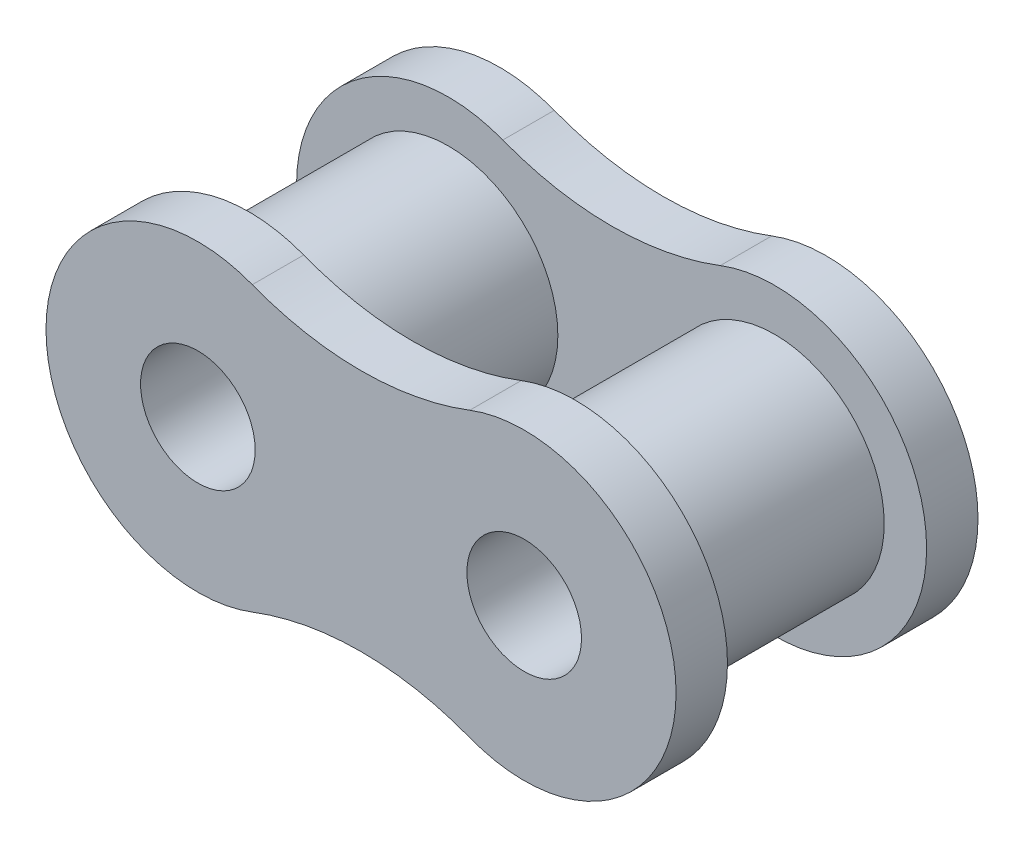
ISO-10303-21;
HEADER;
FILE_DESCRIPTION(('STEP AP214'),'2;1');
FILE_NAME('part.step','',(''),(''),'','','');
FILE_SCHEMA(('AUTOMOTIVE_DESIGN { 1 0 10303 214 1 1 1 1 }'));
ENDSEC;
DATA;
#1=APPLICATION_CONTEXT('core data for automotive mechanical design processes');
#2=APPLICATION_PROTOCOL_DEFINITION('international standard','automotive_design',2000,#1);
#3=PRODUCT_CONTEXT('',#1,'mechanical');
#4=PRODUCT('Part','Part','',(#3));
#5=PRODUCT_RELATED_PRODUCT_CATEGORY('part','',(#4));
#6=PRODUCT_DEFINITION_FORMATION('','',#4);
#7=PRODUCT_DEFINITION_CONTEXT('part definition',#1,'design');
#8=PRODUCT_DEFINITION('design','',#6,#7);
#9=PRODUCT_DEFINITION_SHAPE('','',#8);
#10=(LENGTH_UNIT() NAMED_UNIT(*) SI_UNIT(.MILLI.,.METRE.));
#11=(NAMED_UNIT(*) PLANE_ANGLE_UNIT() SI_UNIT($,.RADIAN.));
#12=(NAMED_UNIT(*) SI_UNIT($,.STERADIAN.) SOLID_ANGLE_UNIT());
#13=UNCERTAINTY_MEASURE_WITH_UNIT(LENGTH_MEASURE(1.E-05),#10,'distance_accuracy_value','');
#14=(GEOMETRIC_REPRESENTATION_CONTEXT(3) GLOBAL_UNCERTAINTY_ASSIGNED_CONTEXT((#13)) GLOBAL_UNIT_ASSIGNED_CONTEXT((#10,
#11,#12)) REPRESENTATION_CONTEXT('',''));
#15=CARTESIAN_POINT('',(0.,0.,0.));
#16=DIRECTION('',(0.,0.,1.));
#17=DIRECTION('',(1.,0.,0.));
#18=AXIS2_PLACEMENT_3D('',#15,#16,#17);
#19=CARTESIAN_POINT('',(6.35,0.,5.875));
#20=DIRECTION('',(0.,0.,-1.));
#21=DIRECTION('',(-1.,0.,0.));
#22=AXIS2_PLACEMENT_3D('',#19,#20,#21);
#23=CYLINDRICAL_SURFACE('',#22,4.26);
#24=CARTESIAN_POINT('',(6.35,0.,3.875));
#25=DIRECTION('',(0.,0.,1.));
#26=DIRECTION('',(1.,0.,0.));
#27=AXIS2_PLACEMENT_3D('',#24,#25,#26);
#28=CIRCLE('',#27,4.26);
#29=CARTESIAN_POINT('',(10.61,0.,3.875));
#30=VERTEX_POINT('',#29);
#31=EDGE_CURVE('E193',#30,#30,#28,.T.);
#32=ORIENTED_EDGE('',*,*,#31,.F.);
#33=EDGE_LOOP('',(#32));
#34=FACE_BOUND('',#33,.T.);
#35=CARTESIAN_POINT('',(6.35,0.,-3.875));
#36=DIRECTION('',(0.,0.,-1.));
#37=DIRECTION('',(-1.,0.,0.));
#38=AXIS2_PLACEMENT_3D('',#35,#36,#37);
#39=CIRCLE('',#38,4.26);
#40=CARTESIAN_POINT('',(2.09,0.,-3.875));
#41=VERTEX_POINT('',#40);
#42=EDGE_CURVE('E11',#41,#41,#39,.T.);
#43=ORIENTED_EDGE('',*,*,#42,.F.);
#44=EDGE_LOOP('',(#43));
#45=FACE_BOUND('',#44,.T.);
#46=ADVANCED_FACE('F42',(#34,#45),#23,.T.);
#47=CARTESIAN_POINT('',(-6.35,0.,5.875));
#48=DIRECTION('',(0.,0.,-1.));
#49=DIRECTION('',(-1.,0.,0.));
#50=AXIS2_PLACEMENT_3D('',#47,#48,#49);
#51=CYLINDRICAL_SURFACE('',#50,4.26);
#52=CARTESIAN_POINT('',(-6.35,0.,3.875));
#53=DIRECTION('',(0.,0.,1.));
#54=DIRECTION('',(1.,0.,0.));
#55=AXIS2_PLACEMENT_3D('',#52,#53,#54);
#56=CIRCLE('',#55,4.26);
#57=CARTESIAN_POINT('',(-2.09,0.,3.875));
#58=VERTEX_POINT('',#57);
#59=EDGE_CURVE('E197',#58,#58,#56,.F.);
#60=ORIENTED_EDGE('',*,*,#59,.T.);
#61=EDGE_LOOP('',(#60));
#62=FACE_BOUND('',#61,.T.);
#63=CARTESIAN_POINT('',(-6.35,0.,-3.875));
#64=DIRECTION('',(0.,0.,-1.));
#65=DIRECTION('',(-1.,0.,0.));
#66=AXIS2_PLACEMENT_3D('',#63,#64,#65);
#67=CIRCLE('',#66,4.26);
#68=CARTESIAN_POINT('',(-10.61,0.,-3.875));
#69=VERTEX_POINT('',#68);
#70=EDGE_CURVE('E45',#69,#69,#67,.T.);
#71=ORIENTED_EDGE('',*,*,#70,.F.);
#72=EDGE_LOOP('',(#71));
#73=FACE_BOUND('',#72,.T.);
#74=ADVANCED_FACE('F205',(#62,#73),#51,.T.);
#75=CARTESIAN_POINT('',(6.35,0.,5.875));
#76=DIRECTION('',(0.,0.,1.));
#77=DIRECTION('',(1.,0.,0.));
#78=AXIS2_PLACEMENT_3D('',#75,#76,#77);
#79=PLANE('',#78);
#80=CARTESIAN_POINT('',(0.,-16.5431526620533,5.875));
#81=DIRECTION('',(0.,0.,-1.));
#82=DIRECTION('',(1.,0.,0.));
#83=AXIS2_PLACEMENT_3D('',#80,#81,#82);
#84=CIRCLE('',#83,11.81);
#85=CARTESIAN_POINT('',(-4.2321388261851,-5.51749617566224,5.875));
#86=VERTEX_POINT('',#85);
#87=CARTESIAN_POINT('',(4.2321388261851,-5.51749617566223,5.875));
#88=VERTEX_POINT('',#87);
#89=EDGE_CURVE('E163',#86,#88,#84,.T.);
#90=ORIENTED_EDGE('',*,*,#89,.T.);
#91=CARTESIAN_POINT('',(6.35,0.,5.875));
#92=DIRECTION('',(0.,0.,1.));
#93=DIRECTION('',(1.,0.,0.));
#94=AXIS2_PLACEMENT_3D('',#91,#92,#93);
#95=CIRCLE('',#94,5.91);
#96=CARTESIAN_POINT('',(4.2321388261851,5.51749617566223,5.875));
#97=VERTEX_POINT('',#96);
#98=EDGE_CURVE('E177',#88,#97,#95,.T.);
#99=ORIENTED_EDGE('',*,*,#98,.T.);
#100=CARTESIAN_POINT('',(0.,16.5431526620533,5.875));
#101=DIRECTION('',(0.,0.,-1.));
#102=DIRECTION('',(1.,0.,0.));
#103=AXIS2_PLACEMENT_3D('',#100,#101,#102);
#104=CIRCLE('',#103,11.81);
#105=CARTESIAN_POINT('',(-4.2321388261851,5.51749617566224,5.875));
#106=VERTEX_POINT('',#105);
#107=EDGE_CURVE('E180',#97,#106,#104,.T.);
#108=ORIENTED_EDGE('',*,*,#107,.T.);
#109=CARTESIAN_POINT('',(-6.35,0.,5.875));
#110=DIRECTION('',(0.,0.,1.));
#111=DIRECTION('',(1.,0.,0.));
#112=AXIS2_PLACEMENT_3D('',#109,#110,#111);
#113=CIRCLE('',#112,5.91);
#114=EDGE_CURVE('E169',#106,#86,#113,.T.);
#115=ORIENTED_EDGE('',*,*,#114,.T.);
#116=EDGE_LOOP('',(#90,#99,#108,#115));
#117=FACE_BOUND('',#116,.T.);
#118=CARTESIAN_POINT('',(6.35,0.,5.875));
#119=DIRECTION('',(0.,0.,1.));
#120=DIRECTION('',(1.,0.,0.));
#121=AXIS2_PLACEMENT_3D('',#118,#119,#120);
#122=CIRCLE('',#121,2.23);
#123=CARTESIAN_POINT('',(8.58,0.,5.875));
#124=VERTEX_POINT('',#123);
#125=EDGE_CURVE('E190',#124,#124,#122,.T.);
#126=ORIENTED_EDGE('',*,*,#125,.F.);
#127=EDGE_LOOP('',(#126));
#128=FACE_BOUND('',#127,.T.);
#129=CARTESIAN_POINT('',(-6.35,0.,5.875));
#130=DIRECTION('',(0.,0.,1.));
#131=DIRECTION('',(1.,0.,0.));
#132=AXIS2_PLACEMENT_3D('',#129,#130,#131);
#133=CIRCLE('',#132,2.23);
#134=CARTESIAN_POINT('',(-4.12,0.,5.875));
#135=VERTEX_POINT('',#134);
#136=EDGE_CURVE('E160',#135,#135,#133,.T.);
#137=ORIENTED_EDGE('',*,*,#136,.F.);
#138=EDGE_LOOP('',(#137));
#139=FACE_BOUND('',#138,.T.);
#140=ADVANCED_FACE('F207',(#117,#128,#139),#79,.T.);
#141=CARTESIAN_POINT('',(6.35,0.,-5.875));
#142=DIRECTION('',(0.,0.,1.));
#143=DIRECTION('',(1.,0.,0.));
#144=AXIS2_PLACEMENT_3D('',#141,#142,#143);
#145=PLANE('',#144);
#146=CARTESIAN_POINT('',(6.35,0.,-5.875));
#147=DIRECTION('',(0.,0.,1.));
#148=DIRECTION('',(1.,0.,0.));
#149=AXIS2_PLACEMENT_3D('',#146,#147,#148);
#150=CIRCLE('',#149,2.23);
#151=CARTESIAN_POINT('',(8.58,0.,-5.875));
#152=VERTEX_POINT('',#151);
#153=EDGE_CURVE('E185',#152,#152,#150,.T.);
#154=ORIENTED_EDGE('',*,*,#153,.T.);
#155=EDGE_LOOP('',(#154));
#156=FACE_BOUND('',#155,.T.);
#157=CARTESIAN_POINT('',(-6.35,0.,-5.875));
#158=DIRECTION('',(0.,0.,1.));
#159=DIRECTION('',(1.,0.,0.));
#160=AXIS2_PLACEMENT_3D('',#157,#158,#159);
#161=CIRCLE('',#160,2.23);
#162=CARTESIAN_POINT('',(-4.12,0.,-5.875));
#163=VERTEX_POINT('',#162);
#164=EDGE_CURVE('E155',#163,#163,#161,.T.);
#165=ORIENTED_EDGE('',*,*,#164,.T.);
#166=EDGE_LOOP('',(#165));
#167=FACE_BOUND('',#166,.T.);
#168=CARTESIAN_POINT('',(0.,-16.5431526620533,-5.875));
#169=DIRECTION('',(0.,0.,-1.));
#170=DIRECTION('',(1.,0.,0.));
#171=AXIS2_PLACEMENT_3D('',#168,#169,#170);
#172=CIRCLE('',#171,11.81);
#173=CARTESIAN_POINT('',(-4.2321388261851,-5.51749617566224,-5.875));
#174=VERTEX_POINT('',#173);
#175=CARTESIAN_POINT('',(4.2321388261851,-5.51749617566223,-5.875));
#176=VERTEX_POINT('',#175);
#177=EDGE_CURVE('E150',#174,#176,#172,.T.);
#178=ORIENTED_EDGE('',*,*,#177,.F.);
#179=CARTESIAN_POINT('',(-6.35,0.,-5.875));
#180=DIRECTION('',(0.,0.,1.));
#181=DIRECTION('',(1.,0.,0.));
#182=AXIS2_PLACEMENT_3D('',#179,#180,#181);
#183=CIRCLE('',#182,5.91);
#184=CARTESIAN_POINT('',(-4.2321388261851,5.51749617566224,-5.875));
#185=VERTEX_POINT('',#184);
#186=EDGE_CURVE('E133',#185,#174,#183,.T.);
#187=ORIENTED_EDGE('',*,*,#186,.F.);
#188=CARTESIAN_POINT('',(0.,16.5431526620533,-5.875));
#189=DIRECTION('',(0.,0.,-1.));
#190=DIRECTION('',(1.,0.,0.));
#191=AXIS2_PLACEMENT_3D('',#188,#189,#190);
#192=CIRCLE('',#191,11.81);
#193=CARTESIAN_POINT('',(4.2321388261851,5.51749617566223,-5.875));
#194=VERTEX_POINT('',#193);
#195=EDGE_CURVE('E145',#194,#185,#192,.T.);
#196=ORIENTED_EDGE('',*,*,#195,.F.);
#197=CARTESIAN_POINT('',(6.35,0.,-5.875));
#198=DIRECTION('',(0.,0.,1.));
#199=DIRECTION('',(1.,0.,0.));
#200=AXIS2_PLACEMENT_3D('',#197,#198,#199);
#201=CIRCLE('',#200,5.91);
#202=EDGE_CURVE('E143',#176,#194,#201,.T.);
#203=ORIENTED_EDGE('',*,*,#202,.F.);
#204=EDGE_LOOP('',(#178,#187,#196,#203));
#205=FACE_BOUND('',#204,.T.);
#206=ADVANCED_FACE('F213',(#156,#167,#205),#145,.F.);
#207=CARTESIAN_POINT('',(6.35,0.,5.875));
#208=DIRECTION('',(0.,0.,-1.));
#209=DIRECTION('',(-1.,0.,0.));
#210=AXIS2_PLACEMENT_3D('',#207,#208,#209);
#211=CYLINDRICAL_SURFACE('',#210,2.23);
#212=ORIENTED_EDGE('',*,*,#125,.T.);
#213=EDGE_LOOP('',(#212));
#214=FACE_BOUND('',#213,.T.);
#215=ORIENTED_EDGE('',*,*,#153,.F.);
#216=EDGE_LOOP('',(#215));
#217=FACE_BOUND('',#216,.T.);
#218=ADVANCED_FACE('F237',(#214,#217),#211,.F.);
#219=CARTESIAN_POINT('',(0.,-16.5431526620533,3.875));
#220=DIRECTION('',(0.,0.,1.));
#221=DIRECTION('',(1.,0.,0.));
#222=AXIS2_PLACEMENT_3D('',#219,#220,#221);
#223=CYLINDRICAL_SURFACE('',#222,11.81);
#224=ORIENTED_EDGE('',*,*,#89,.F.);
#225=DIRECTION('',(0.,0.,1.));
#226=VECTOR('',#225,1.);
#227=CARTESIAN_POINT('',(-4.2321388261851,-5.51749617566224,3.875));
#228=LINE('',#227,#226);
#229=CARTESIAN_POINT('',(-4.2321388261851,-5.51749617566224,3.875));
#230=VERTEX_POINT('',#229);
#231=EDGE_CURVE('E59',#230,#86,#228,.T.);
#232=ORIENTED_EDGE('',*,*,#231,.F.);
#233=CARTESIAN_POINT('',(0.,-16.5431526620533,3.875));
#234=DIRECTION('',(0.,0.,-1.));
#235=DIRECTION('',(1.,0.,0.));
#236=AXIS2_PLACEMENT_3D('',#233,#234,#235);
#237=CIRCLE('',#236,11.81);
#238=CARTESIAN_POINT('',(4.2321388261851,-5.51749617566223,3.875));
#239=VERTEX_POINT('',#238);
#240=EDGE_CURVE('E166',#230,#239,#237,.T.);
#241=ORIENTED_EDGE('',*,*,#240,.T.);
#242=DIRECTION('',(0.,0.,1.));
#243=VECTOR('',#242,1.);
#244=CARTESIAN_POINT('',(4.2321388261851,-5.51749617566223,3.875));
#245=LINE('',#244,#243);
#246=EDGE_CURVE('E88',#239,#88,#245,.T.);
#247=ORIENTED_EDGE('',*,*,#246,.T.);
#248=EDGE_LOOP('',(#224,#232,#241,#247));
#249=FACE_BOUND('',#248,.T.);
#250=ADVANCED_FACE('F230',(#249),#223,.F.);
#251=CARTESIAN_POINT('',(-6.35,0.,3.875));
#252=DIRECTION('',(0.,0.,1.));
#253=DIRECTION('',(1.,0.,0.));
#254=AXIS2_PLACEMENT_3D('',#251,#252,#253);
#255=CYLINDRICAL_SURFACE('',#254,5.91);
#256=ORIENTED_EDGE('',*,*,#114,.F.);
#257=DIRECTION('',(0.,0.,1.));
#258=VECTOR('',#257,1.);
#259=CARTESIAN_POINT('',(-4.2321388261851,5.51749617566224,3.875));
#260=LINE('',#259,#258);
#261=CARTESIAN_POINT('',(-4.2321388261851,5.51749617566224,3.875));
#262=VERTEX_POINT('',#261);
#263=EDGE_CURVE('E77',#262,#106,#260,.T.);
#264=ORIENTED_EDGE('',*,*,#263,.F.);
#265=CARTESIAN_POINT('',(-6.35,0.,3.875));
#266=DIRECTION('',(0.,0.,1.));
#267=DIRECTION('',(1.,0.,0.));
#268=AXIS2_PLACEMENT_3D('',#265,#266,#267);
#269=CIRCLE('',#268,5.91);
#270=EDGE_CURVE('E173',#262,#230,#269,.T.);
#271=ORIENTED_EDGE('',*,*,#270,.T.);
#272=ORIENTED_EDGE('',*,*,#231,.T.);
#273=EDGE_LOOP('',(#256,#264,#271,#272));
#274=FACE_BOUND('',#273,.T.);
#275=ADVANCED_FACE('F226',(#274),#255,.T.);
#276=CARTESIAN_POINT('',(0.,16.5431526620533,3.875));
#277=DIRECTION('',(0.,0.,1.));
#278=DIRECTION('',(1.,0.,0.));
#279=AXIS2_PLACEMENT_3D('',#276,#277,#278);
#280=CYLINDRICAL_SURFACE('',#279,11.81);
#281=ORIENTED_EDGE('',*,*,#107,.F.);
#282=DIRECTION('',(0.,0.,1.));
#283=VECTOR('',#282,1.);
#284=CARTESIAN_POINT('',(4.2321388261851,5.51749617566223,3.875));
#285=LINE('',#284,#283);
#286=CARTESIAN_POINT('',(4.2321388261851,5.51749617566223,3.875));
#287=VERTEX_POINT('',#286);
#288=EDGE_CURVE('E187',#287,#97,#285,.T.);
#289=ORIENTED_EDGE('',*,*,#288,.F.);
#290=CARTESIAN_POINT('',(0.,16.5431526620533,3.875));
#291=DIRECTION('',(0.,0.,-1.));
#292=DIRECTION('',(1.,0.,0.));
#293=AXIS2_PLACEMENT_3D('',#290,#291,#292);
#294=CIRCLE('',#293,11.81);
#295=EDGE_CURVE('E171',#287,#262,#294,.T.);
#296=ORIENTED_EDGE('',*,*,#295,.T.);
#297=ORIENTED_EDGE('',*,*,#263,.T.);
#298=EDGE_LOOP('',(#281,#289,#296,#297));
#299=FACE_BOUND('',#298,.T.);
#300=ADVANCED_FACE('F229',(#299),#280,.F.);
#301=CARTESIAN_POINT('',(6.35,0.,3.875));
#302=DIRECTION('',(0.,0.,1.));
#303=DIRECTION('',(1.,0.,0.));
#304=AXIS2_PLACEMENT_3D('',#301,#302,#303);
#305=CYLINDRICAL_SURFACE('',#304,5.91);
#306=ORIENTED_EDGE('',*,*,#98,.F.);
#307=ORIENTED_EDGE('',*,*,#246,.F.);
#308=CARTESIAN_POINT('',(6.35,0.,3.875));
#309=DIRECTION('',(0.,0.,1.));
#310=DIRECTION('',(1.,0.,0.));
#311=AXIS2_PLACEMENT_3D('',#308,#309,#310);
#312=CIRCLE('',#311,5.91);
#313=EDGE_CURVE('E168',#239,#287,#312,.T.);
#314=ORIENTED_EDGE('',*,*,#313,.T.);
#315=ORIENTED_EDGE('',*,*,#288,.T.);
#316=EDGE_LOOP('',(#306,#307,#314,#315));
#317=FACE_BOUND('',#316,.T.);
#318=ADVANCED_FACE('F224',(#317),#305,.T.);
#319=CARTESIAN_POINT('',(-3.175,-8.27157633102663,3.875));
#320=DIRECTION('',(0.,0.,1.));
#321=DIRECTION('',(1.,0.,0.));
#322=AXIS2_PLACEMENT_3D('',#319,#320,#321);
#323=PLANE('',#322);
#324=ORIENTED_EDGE('',*,*,#59,.F.);
#325=EDGE_LOOP('',(#324));
#326=FACE_BOUND('',#325,.T.);
#327=ORIENTED_EDGE('',*,*,#31,.T.);
#328=EDGE_LOOP('',(#327));
#329=FACE_BOUND('',#328,.T.);
#330=ORIENTED_EDGE('',*,*,#240,.F.);
#331=ORIENTED_EDGE('',*,*,#270,.F.);
#332=ORIENTED_EDGE('',*,*,#295,.F.);
#333=ORIENTED_EDGE('',*,*,#313,.F.);
#334=EDGE_LOOP('',(#330,#331,#332,#333));
#335=FACE_BOUND('',#334,.T.);
#336=ADVANCED_FACE('F221',(#326,#329,#335),#323,.F.);
#337=CARTESIAN_POINT('',(-6.35,0.,5.875));
#338=DIRECTION('',(0.,0.,-1.));
#339=DIRECTION('',(-1.,0.,0.));
#340=AXIS2_PLACEMENT_3D('',#337,#338,#339);
#341=CYLINDRICAL_SURFACE('',#340,2.23);
#342=ORIENTED_EDGE('',*,*,#136,.T.);
#343=EDGE_LOOP('',(#342));
#344=FACE_BOUND('',#343,.T.);
#345=ORIENTED_EDGE('',*,*,#164,.F.);
#346=EDGE_LOOP('',(#345));
#347=FACE_BOUND('',#346,.T.);
#348=ADVANCED_FACE('F219',(#344,#347),#341,.F.);
#349=CARTESIAN_POINT('',(-3.175,-8.27157633102663,-3.875));
#350=DIRECTION('',(0.,0.,-1.));
#351=DIRECTION('',(1.,0.,0.));
#352=AXIS2_PLACEMENT_3D('',#349,#350,#351);
#353=PLANE('',#352);
#354=ORIENTED_EDGE('',*,*,#42,.T.);
#355=EDGE_LOOP('',(#354));
#356=FACE_BOUND('',#355,.T.);
#357=ORIENTED_EDGE('',*,*,#70,.T.);
#358=EDGE_LOOP('',(#357));
#359=FACE_BOUND('',#358,.T.);
#360=CARTESIAN_POINT('',(0.,-16.5431526620533,-3.875));
#361=DIRECTION('',(0.,0.,-1.));
#362=DIRECTION('',(1.,0.,0.));
#363=AXIS2_PLACEMENT_3D('',#360,#361,#362);
#364=CIRCLE('',#363,11.81);
#365=CARTESIAN_POINT('',(-4.2321388261851,-5.51749617566224,-3.875));
#366=VERTEX_POINT('',#365);
#367=CARTESIAN_POINT('',(4.2321388261851,-5.51749617566223,-3.875));
#368=VERTEX_POINT('',#367);
#369=EDGE_CURVE('E121',#366,#368,#364,.T.);
#370=ORIENTED_EDGE('',*,*,#369,.T.);
#371=CARTESIAN_POINT('',(6.35,0.,-3.875));
#372=DIRECTION('',(0.,0.,1.));
#373=DIRECTION('',(1.,0.,0.));
#374=AXIS2_PLACEMENT_3D('',#371,#372,#373);
#375=CIRCLE('',#374,5.91);
#376=CARTESIAN_POINT('',(4.2321388261851,5.51749617566223,-3.875));
#377=VERTEX_POINT('',#376);
#378=EDGE_CURVE('E138',#368,#377,#375,.T.);
#379=ORIENTED_EDGE('',*,*,#378,.T.);
#380=CARTESIAN_POINT('',(0.,16.5431526620533,-3.875));
#381=DIRECTION('',(0.,0.,-1.));
#382=DIRECTION('',(1.,0.,0.));
#383=AXIS2_PLACEMENT_3D('',#380,#381,#382);
#384=CIRCLE('',#383,11.81);
#385=CARTESIAN_POINT('',(-4.2321388261851,5.51749617566224,-3.875));
#386=VERTEX_POINT('',#385);
#387=EDGE_CURVE('E124',#377,#386,#384,.T.);
#388=ORIENTED_EDGE('',*,*,#387,.T.);
#389=CARTESIAN_POINT('',(-6.35,0.,-3.875));
#390=DIRECTION('',(0.,0.,1.));
#391=DIRECTION('',(1.,0.,0.));
#392=AXIS2_PLACEMENT_3D('',#389,#390,#391);
#393=CIRCLE('',#392,5.91);
#394=EDGE_CURVE('E117',#386,#366,#393,.T.);
#395=ORIENTED_EDGE('',*,*,#394,.T.);
#396=EDGE_LOOP('',(#370,#379,#388,#395));
#397=FACE_BOUND('',#396,.T.);
#398=ADVANCED_FACE('F119',(#356,#359,#397),#353,.F.);
#399=CARTESIAN_POINT('',(0.,-16.5431526620533,-3.875));
#400=DIRECTION('',(0.,0.,-1.));
#401=DIRECTION('',(-1.,0.,0.));
#402=AXIS2_PLACEMENT_3D('',#399,#400,#401);
#403=CYLINDRICAL_SURFACE('',#402,11.81);
#404=ORIENTED_EDGE('',*,*,#177,.T.);
#405=DIRECTION('',(0.,0.,-1.));
#406=VECTOR('',#405,1.);
#407=CARTESIAN_POINT('',(4.2321388261851,-5.51749617566223,-3.875));
#408=LINE('',#407,#406);
#409=EDGE_CURVE('E142',#368,#176,#408,.T.);
#410=ORIENTED_EDGE('',*,*,#409,.F.);
#411=ORIENTED_EDGE('',*,*,#369,.F.);
#412=DIRECTION('',(0.,0.,-1.));
#413=VECTOR('',#412,1.);
#414=CARTESIAN_POINT('',(-4.2321388261851,-5.51749617566224,-3.875));
#415=LINE('',#414,#413);
#416=EDGE_CURVE('E130',#366,#174,#415,.T.);
#417=ORIENTED_EDGE('',*,*,#416,.T.);
#418=EDGE_LOOP('',(#404,#410,#411,#417));
#419=FACE_BOUND('',#418,.T.);
#420=ADVANCED_FACE('F140',(#419),#403,.F.);
#421=CARTESIAN_POINT('',(6.35,0.,-3.875));
#422=DIRECTION('',(0.,0.,-1.));
#423=DIRECTION('',(-1.,0.,0.));
#424=AXIS2_PLACEMENT_3D('',#421,#422,#423);
#425=CYLINDRICAL_SURFACE('',#424,5.91);
#426=ORIENTED_EDGE('',*,*,#202,.T.);
#427=DIRECTION('',(0.,0.,-1.));
#428=VECTOR('',#427,1.);
#429=CARTESIAN_POINT('',(4.2321388261851,5.51749617566223,-3.875));
#430=LINE('',#429,#428);
#431=EDGE_CURVE('E156',#377,#194,#430,.T.);
#432=ORIENTED_EDGE('',*,*,#431,.F.);
#433=ORIENTED_EDGE('',*,*,#378,.F.);
#434=ORIENTED_EDGE('',*,*,#409,.T.);
#435=EDGE_LOOP('',(#426,#432,#433,#434));
#436=FACE_BOUND('',#435,.T.);
#437=ADVANCED_FACE('F251',(#436),#425,.T.);
#438=CARTESIAN_POINT('',(0.,16.5431526620533,-3.875));
#439=DIRECTION('',(0.,0.,-1.));
#440=DIRECTION('',(-1.,0.,0.));
#441=AXIS2_PLACEMENT_3D('',#438,#439,#440);
#442=CYLINDRICAL_SURFACE('',#441,11.81);
#443=ORIENTED_EDGE('',*,*,#195,.T.);
#444=DIRECTION('',(0.,0.,-1.));
#445=VECTOR('',#444,1.);
#446=CARTESIAN_POINT('',(-4.2321388261851,5.51749617566224,-3.875));
#447=LINE('',#446,#445);
#448=EDGE_CURVE('E137',#386,#185,#447,.T.);
#449=ORIENTED_EDGE('',*,*,#448,.F.);
#450=ORIENTED_EDGE('',*,*,#387,.F.);
#451=ORIENTED_EDGE('',*,*,#431,.T.);
#452=EDGE_LOOP('',(#443,#449,#450,#451));
#453=FACE_BOUND('',#452,.T.);
#454=ADVANCED_FACE('F253',(#453),#442,.F.);
#455=CARTESIAN_POINT('',(-6.35,0.,-3.875));
#456=DIRECTION('',(0.,0.,-1.));
#457=DIRECTION('',(-1.,0.,0.));
#458=AXIS2_PLACEMENT_3D('',#455,#456,#457);
#459=CYLINDRICAL_SURFACE('',#458,5.91);
#460=ORIENTED_EDGE('',*,*,#186,.T.);
#461=ORIENTED_EDGE('',*,*,#416,.F.);
#462=ORIENTED_EDGE('',*,*,#394,.F.);
#463=ORIENTED_EDGE('',*,*,#448,.T.);
#464=EDGE_LOOP('',(#460,#461,#462,#463));
#465=FACE_BOUND('',#464,.T.);
#466=ADVANCED_FACE('F131',(#465),#459,.T.);
#467=CLOSED_SHELL('',(#46,#74,#140,#206,#218,#250,#275,#300,#318,#336,#348,#398,#420,#437,#454,#466));
#468=MANIFOLD_SOLID_BREP('B2',#467);
#469=ADVANCED_BREP_SHAPE_REPRESENTATION('',(#18,#468),#14);
#470=SHAPE_DEFINITION_REPRESENTATION(#9,#469);
ENDSEC;
END-ISO-10303-21;
